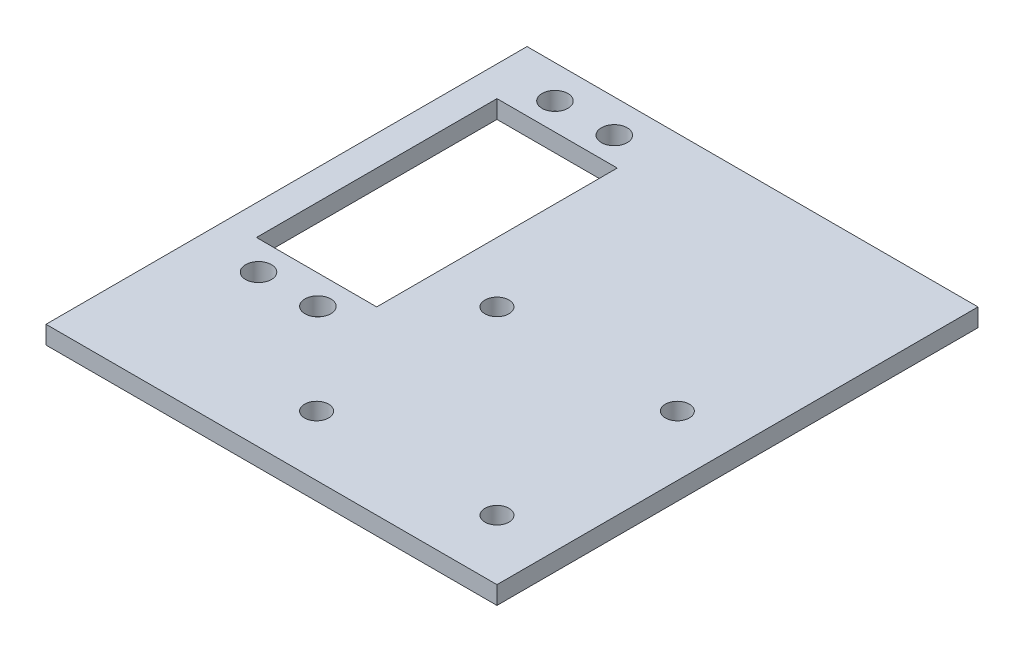
ISO-10303-21;
HEADER;
FILE_DESCRIPTION(('STEP AP214'),'2;1');
FILE_NAME('part.step','',(''),(''),'','','');
FILE_SCHEMA(('AUTOMOTIVE_DESIGN { 1 0 10303 214 1 1 1 1 }'));
ENDSEC;
DATA;
#1=APPLICATION_CONTEXT('core data for automotive mechanical design processes');
#2=APPLICATION_PROTOCOL_DEFINITION('international standard','automotive_design',2000,#1);
#3=PRODUCT_CONTEXT('',#1,'mechanical');
#4=PRODUCT('Part','Part','',(#3));
#5=PRODUCT_RELATED_PRODUCT_CATEGORY('part','',(#4));
#6=PRODUCT_DEFINITION_FORMATION('','',#4);
#7=PRODUCT_DEFINITION_CONTEXT('part definition',#1,'design');
#8=PRODUCT_DEFINITION('design','',#6,#7);
#9=PRODUCT_DEFINITION_SHAPE('','',#8);
#10=(LENGTH_UNIT() NAMED_UNIT(*) SI_UNIT(.MILLI.,.METRE.));
#11=(NAMED_UNIT(*) PLANE_ANGLE_UNIT() SI_UNIT($,.RADIAN.));
#12=(NAMED_UNIT(*) SI_UNIT($,.STERADIAN.) SOLID_ANGLE_UNIT());
#13=UNCERTAINTY_MEASURE_WITH_UNIT(LENGTH_MEASURE(1.E-05),#10,'distance_accuracy_value','');
#14=(GEOMETRIC_REPRESENTATION_CONTEXT(3) GLOBAL_UNCERTAINTY_ASSIGNED_CONTEXT((#13)) GLOBAL_UNIT_ASSIGNED_CONTEXT((#10,
#11,#12)) REPRESENTATION_CONTEXT('',''));
#15=CARTESIAN_POINT('',(0.,0.,0.));
#16=DIRECTION('',(0.,0.,1.));
#17=DIRECTION('',(1.,0.,0.));
#18=AXIS2_PLACEMENT_3D('',#15,#16,#17);
#19=CARTESIAN_POINT('',(-40.,3.,-40.));
#20=DIRECTION('',(0.,0.,1.));
#21=DIRECTION('',(1.,0.,0.));
#22=AXIS2_PLACEMENT_3D('',#19,#20,#21);
#23=PLANE('',#22);
#24=DIRECTION('',(-1.,0.,0.));
#25=VECTOR('',#24,1.);
#26=CARTESIAN_POINT('',(-40.,3.,-40.));
#27=LINE('',#26,#25);
#28=CARTESIAN_POINT('',(35.0000000000232,3.,-40.));
#29=VERTEX_POINT('',#28);
#30=CARTESIAN_POINT('',(-40.,3.,-40.));
#31=VERTEX_POINT('',#30);
#32=EDGE_CURVE('E119',#29,#31,#27,.T.);
#33=ORIENTED_EDGE('',*,*,#32,.F.);
#34=DIRECTION('',(0.,1.,0.));
#35=VECTOR('',#34,1.);
#36=CARTESIAN_POINT('',(35.0000000000232,-7.,-40.));
#37=LINE('',#36,#35);
#38=CARTESIAN_POINT('',(35.0000000000232,0.,-40.));
#39=VERTEX_POINT('',#38);
#40=EDGE_CURVE('E97',#39,#29,#37,.T.);
#41=ORIENTED_EDGE('',*,*,#40,.F.);
#42=DIRECTION('',(-1.,0.,0.));
#43=VECTOR('',#42,1.);
#44=CARTESIAN_POINT('',(-40.,0.,-40.));
#45=LINE('',#44,#43);
#46=CARTESIAN_POINT('',(-40.,0.,-40.));
#47=VERTEX_POINT('',#46);
#48=EDGE_CURVE('E123',#39,#47,#45,.T.);
#49=ORIENTED_EDGE('',*,*,#48,.T.);
#50=DIRECTION('',(0.,-1.,0.));
#51=VECTOR('',#50,1.);
#52=CARTESIAN_POINT('',(-40.,3.,-40.));
#53=LINE('',#52,#51);
#54=EDGE_CURVE('E40',#31,#47,#53,.T.);
#55=ORIENTED_EDGE('',*,*,#54,.F.);
#56=EDGE_LOOP('',(#33,#41,#49,#55));
#57=FACE_BOUND('',#56,.T.);
#58=ADVANCED_FACE('F33',(#57),#23,.F.);
#59=CARTESIAN_POINT('',(-40.,3.,40.));
#60=DIRECTION('',(1.,0.,0.));
#61=DIRECTION('',(0.,0.,-1.));
#62=AXIS2_PLACEMENT_3D('',#59,#60,#61);
#63=PLANE('',#62);
#64=DIRECTION('',(0.,0.,1.));
#65=VECTOR('',#64,1.);
#66=CARTESIAN_POINT('',(-40.,0.,40.));
#67=LINE('',#66,#65);
#68=CARTESIAN_POINT('',(-40.,0.,40.));
#69=VERTEX_POINT('',#68);
#70=EDGE_CURVE('E125',#47,#69,#67,.T.);
#71=ORIENTED_EDGE('',*,*,#70,.T.);
#72=DIRECTION('',(0.,-1.,0.));
#73=VECTOR('',#72,1.);
#74=CARTESIAN_POINT('',(-40.,3.,40.));
#75=LINE('',#74,#73);
#76=CARTESIAN_POINT('',(-40.,3.,40.));
#77=VERTEX_POINT('',#76);
#78=EDGE_CURVE('E116',#77,#69,#75,.T.);
#79=ORIENTED_EDGE('',*,*,#78,.F.);
#80=DIRECTION('',(0.,0.,1.));
#81=VECTOR('',#80,1.);
#82=CARTESIAN_POINT('',(-40.,3.,40.));
#83=LINE('',#82,#81);
#84=EDGE_CURVE('E114',#31,#77,#83,.T.);
#85=ORIENTED_EDGE('',*,*,#84,.F.);
#86=ORIENTED_EDGE('',*,*,#54,.T.);
#87=EDGE_LOOP('',(#71,#79,#85,#86));
#88=FACE_BOUND('',#87,.T.);
#89=ADVANCED_FACE('F132',(#88),#63,.F.);
#90=CARTESIAN_POINT('',(-40.,3.,40.));
#91=DIRECTION('',(0.,0.,-1.));
#92=DIRECTION('',(-1.,0.,0.));
#93=AXIS2_PLACEMENT_3D('',#90,#91,#92);
#94=PLANE('',#93);
#95=DIRECTION('',(1.,0.,0.));
#96=VECTOR('',#95,1.);
#97=CARTESIAN_POINT('',(-40.,0.,40.));
#98=LINE('',#97,#96);
#99=CARTESIAN_POINT('',(35.0000000000232,0.,40.));
#100=VERTEX_POINT('',#99);
#101=EDGE_CURVE('E110',#69,#100,#98,.T.);
#102=ORIENTED_EDGE('',*,*,#101,.T.);
#103=DIRECTION('',(0.,1.,0.));
#104=VECTOR('',#103,1.);
#105=CARTESIAN_POINT('',(35.0000000000232,-7.,40.));
#106=LINE('',#105,#104);
#107=CARTESIAN_POINT('',(35.0000000000232,3.,40.));
#108=VERTEX_POINT('',#107);
#109=EDGE_CURVE('E46',#100,#108,#106,.T.);
#110=ORIENTED_EDGE('',*,*,#109,.T.);
#111=DIRECTION('',(1.,0.,0.));
#112=VECTOR('',#111,1.);
#113=CARTESIAN_POINT('',(-40.,3.,40.));
#114=LINE('',#113,#112);
#115=EDGE_CURVE('E108',#77,#108,#114,.T.);
#116=ORIENTED_EDGE('',*,*,#115,.F.);
#117=ORIENTED_EDGE('',*,*,#78,.T.);
#118=EDGE_LOOP('',(#102,#110,#116,#117));
#119=FACE_BOUND('',#118,.T.);
#120=ADVANCED_FACE('F106',(#119),#94,.F.);
#121=CARTESIAN_POINT('',(0.,3.,0.));
#122=DIRECTION('',(0.,-1.,0.));
#123=DIRECTION('',(0.,0.,-1.));
#124=AXIS2_PLACEMENT_3D('',#121,#122,#123);
#125=PLANE('',#124);
#126=CARTESIAN_POINT('',(25.0000000000232,3.,30.));
#127=DIRECTION('',(0.,-1.,0.));
#128=DIRECTION('',(0.,0.,-1.));
#129=AXIS2_PLACEMENT_3D('',#126,#127,#128);
#130=CIRCLE('',#129,2.);
#131=CARTESIAN_POINT('',(25.0000000000232,3.,28.));
#132=VERTEX_POINT('',#131);
#133=EDGE_CURVE('E101',#132,#132,#130,.T.);
#134=ORIENTED_EDGE('',*,*,#133,.T.);
#135=EDGE_LOOP('',(#134));
#136=FACE_BOUND('',#135,.T.);
#137=CARTESIAN_POINT('',(-4.99999999997651,3.,30.));
#138=DIRECTION('',(0.,-1.,0.));
#139=DIRECTION('',(0.,0.,-1.));
#140=AXIS2_PLACEMENT_3D('',#137,#138,#139);
#141=CIRCLE('',#140,2.);
#142=CARTESIAN_POINT('',(-4.99999999997651,3.,28.));
#143=VERTEX_POINT('',#142);
#144=EDGE_CURVE('E306',#143,#143,#141,.T.);
#145=ORIENTED_EDGE('',*,*,#144,.T.);
#146=EDGE_LOOP('',(#145));
#147=FACE_BOUND('',#146,.T.);
#148=CARTESIAN_POINT('',(-4.99999999997654,3.,1.16226472890446E-13));
#149=DIRECTION('',(0.,-1.,0.));
#150=DIRECTION('',(0.,0.,-1.));
#151=AXIS2_PLACEMENT_3D('',#148,#149,#150);
#152=CIRCLE('',#151,2.);
#153=CARTESIAN_POINT('',(-4.99999999997654,3.,-1.99999999999989));
#154=VERTEX_POINT('',#153);
#155=EDGE_CURVE('E308',#154,#154,#152,.T.);
#156=ORIENTED_EDGE('',*,*,#155,.T.);
#157=EDGE_LOOP('',(#156));
#158=FACE_BOUND('',#157,.T.);
#159=CARTESIAN_POINT('',(25.0000000000232,3.,1.16226472890446E-13));
#160=DIRECTION('',(0.,-1.,0.));
#161=DIRECTION('',(0.,0.,-1.));
#162=AXIS2_PLACEMENT_3D('',#159,#160,#161);
#163=CIRCLE('',#162,2.);
#164=CARTESIAN_POINT('',(25.0000000000232,3.,-1.99999999999989));
#165=VERTEX_POINT('',#164);
#166=EDGE_CURVE('E312',#165,#165,#163,.T.);
#167=ORIENTED_EDGE('',*,*,#166,.T.);
#168=EDGE_LOOP('',(#167));
#169=FACE_BOUND('',#168,.T.);
#170=CARTESIAN_POINT('',(-29.8449999999992,3.,14.8100000000001));
#171=DIRECTION('',(0.,1.,0.));
#172=DIRECTION('',(0.,0.,1.));
#173=AXIS2_PLACEMENT_3D('',#170,#171,#172);
#174=CIRCLE('',#173,2.14999999999946);
#175=CARTESIAN_POINT('',(-29.8449999999992,3.,16.9599999999995));
#176=VERTEX_POINT('',#175);
#177=EDGE_CURVE('E138',#176,#176,#174,.T.);
#178=ORIENTED_EDGE('',*,*,#177,.F.);
#179=EDGE_LOOP('',(#178));
#180=FACE_BOUND('',#179,.T.);
#181=CARTESIAN_POINT('',(-19.9749999999992,3.,14.81));
#182=DIRECTION('',(0.,1.,0.));
#183=DIRECTION('',(0.,0.,1.));
#184=AXIS2_PLACEMENT_3D('',#181,#182,#183);
#185=CIRCLE('',#184,2.1499999999995);
#186=CARTESIAN_POINT('',(-19.9749999999992,3.,16.9599999999995));
#187=VERTEX_POINT('',#186);
#188=EDGE_CURVE('E160',#187,#187,#185,.T.);
#189=ORIENTED_EDGE('',*,*,#188,.F.);
#190=EDGE_LOOP('',(#189));
#191=FACE_BOUND('',#190,.T.);
#192=CARTESIAN_POINT('',(-19.9749999999997,3.,-34.49));
#193=DIRECTION('',(0.,1.,0.));
#194=DIRECTION('',(0.,0.,1.));
#195=AXIS2_PLACEMENT_3D('',#192,#193,#194);
#196=CIRCLE('',#195,2.15);
#197=CARTESIAN_POINT('',(-19.9749999999997,3.,-32.34));
#198=VERTEX_POINT('',#197);
#199=EDGE_CURVE('E154',#198,#198,#196,.T.);
#200=ORIENTED_EDGE('',*,*,#199,.F.);
#201=EDGE_LOOP('',(#200));
#202=FACE_BOUND('',#201,.T.);
#203=CARTESIAN_POINT('',(-29.8449999999997,3.,-34.4899999999999));
#204=DIRECTION('',(0.,1.,0.));
#205=DIRECTION('',(0.,0.,1.));
#206=AXIS2_PLACEMENT_3D('',#203,#204,#205);
#207=CIRCLE('',#206,2.15);
#208=CARTESIAN_POINT('',(-29.8449999999997,3.,-32.3399999999999));
#209=VERTEX_POINT('',#208);
#210=EDGE_CURVE('E148',#209,#209,#207,.T.);
#211=ORIENTED_EDGE('',*,*,#210,.F.);
#212=EDGE_LOOP('',(#211));
#213=FACE_BOUND('',#212,.T.);
#214=DIRECTION('',(1.,0.,0.));
#215=VECTOR('',#214,1.);
#216=CARTESIAN_POINT('',(-35.,3.,10.0000000000001));
#217=LINE('',#216,#215);
#218=CARTESIAN_POINT('',(-35.,3.,10.0000000000001));
#219=VERTEX_POINT('',#218);
#220=CARTESIAN_POINT('',(-15.,3.,10.0000000000001));
#221=VERTEX_POINT('',#220);
#222=EDGE_CURVE('E180',#219,#221,#217,.T.);
#223=ORIENTED_EDGE('',*,*,#222,.F.);
#224=DIRECTION('',(0.,0.,1.));
#225=VECTOR('',#224,1.);
#226=CARTESIAN_POINT('',(-35.,3.,-29.9999999999999));
#227=LINE('',#226,#225);
#228=CARTESIAN_POINT('',(-35.,3.,-29.9999999999999));
#229=VERTEX_POINT('',#228);
#230=EDGE_CURVE('E54',#229,#219,#227,.T.);
#231=ORIENTED_EDGE('',*,*,#230,.F.);
#232=DIRECTION('',(-1.,0.,0.));
#233=VECTOR('',#232,1.);
#234=CARTESIAN_POINT('',(-35.,3.,-29.9999999999999));
#235=LINE('',#234,#233);
#236=CARTESIAN_POINT('',(-15.,3.,-29.9999999999999));
#237=VERTEX_POINT('',#236);
#238=EDGE_CURVE('E169',#237,#229,#235,.T.);
#239=ORIENTED_EDGE('',*,*,#238,.F.);
#240=DIRECTION('',(0.,0.,-1.));
#241=VECTOR('',#240,1.);
#242=CARTESIAN_POINT('',(-15.,3.,-29.9999999999999));
#243=LINE('',#242,#241);
#244=EDGE_CURVE('E183',#221,#237,#243,.T.);
#245=ORIENTED_EDGE('',*,*,#244,.F.);
#246=EDGE_LOOP('',(#223,#231,#239,#245));
#247=FACE_BOUND('',#246,.T.);
#248=ORIENTED_EDGE('',*,*,#115,.T.);
#249=DIRECTION('',(0.,0.,1.));
#250=VECTOR('',#249,1.);
#251=CARTESIAN_POINT('',(35.0000000000232,3.,40.));
#252=LINE('',#251,#250);
#253=EDGE_CURVE('E94',#29,#108,#252,.T.);
#254=ORIENTED_EDGE('',*,*,#253,.F.);
#255=ORIENTED_EDGE('',*,*,#32,.T.);
#256=ORIENTED_EDGE('',*,*,#84,.T.);
#257=EDGE_LOOP('',(#248,#254,#255,#256));
#258=FACE_BOUND('',#257,.T.);
#259=ADVANCED_FACE('F112',(#136,#147,#158,#169,#180,#191,#202,#213,#247,#258),#125,.F.);
#260=CARTESIAN_POINT('',(0.,0.,0.));
#261=DIRECTION('',(0.,-1.,0.));
#262=DIRECTION('',(0.,0.,-1.));
#263=AXIS2_PLACEMENT_3D('',#260,#261,#262);
#264=PLANE('',#263);
#265=CARTESIAN_POINT('',(25.0000000000232,0.,30.));
#266=DIRECTION('',(0.,-1.,0.));
#267=DIRECTION('',(0.,0.,1.));
#268=AXIS2_PLACEMENT_3D('',#265,#266,#267);
#269=CIRCLE('',#268,2.);
#270=CARTESIAN_POINT('',(25.0000000000232,0.,32.));
#271=VERTEX_POINT('',#270);
#272=EDGE_CURVE('E320',#271,#271,#269,.T.);
#273=ORIENTED_EDGE('',*,*,#272,.F.);
#274=EDGE_LOOP('',(#273));
#275=FACE_BOUND('',#274,.T.);
#276=CARTESIAN_POINT('',(-4.99999999997651,0.,30.));
#277=DIRECTION('',(0.,-1.,0.));
#278=DIRECTION('',(0.,0.,-1.));
#279=AXIS2_PLACEMENT_3D('',#276,#277,#278);
#280=CIRCLE('',#279,2.);
#281=CARTESIAN_POINT('',(-4.99999999997651,0.,28.));
#282=VERTEX_POINT('',#281);
#283=EDGE_CURVE('E303',#282,#282,#280,.T.);
#284=ORIENTED_EDGE('',*,*,#283,.F.);
#285=EDGE_LOOP('',(#284));
#286=FACE_BOUND('',#285,.T.);
#287=CARTESIAN_POINT('',(-4.99999999997654,0.,1.16226472890446E-13));
#288=DIRECTION('',(0.,-1.,0.));
#289=DIRECTION('',(0.,0.,1.));
#290=AXIS2_PLACEMENT_3D('',#287,#288,#289);
#291=CIRCLE('',#290,2.);
#292=CARTESIAN_POINT('',(-4.99999999997654,0.,2.00000000000012));
#293=VERTEX_POINT('',#292);
#294=EDGE_CURVE('E319',#293,#293,#291,.T.);
#295=ORIENTED_EDGE('',*,*,#294,.F.);
#296=EDGE_LOOP('',(#295));
#297=FACE_BOUND('',#296,.T.);
#298=CARTESIAN_POINT('',(25.0000000000232,0.,1.16226472890446E-13));
#299=DIRECTION('',(0.,-1.,0.));
#300=DIRECTION('',(0.,0.,-1.));
#301=AXIS2_PLACEMENT_3D('',#298,#299,#300);
#302=CIRCLE('',#301,2.);
#303=CARTESIAN_POINT('',(25.0000000000232,0.,-1.99999999999989));
#304=VERTEX_POINT('',#303);
#305=EDGE_CURVE('E317',#304,#304,#302,.T.);
#306=ORIENTED_EDGE('',*,*,#305,.F.);
#307=EDGE_LOOP('',(#306));
#308=FACE_BOUND('',#307,.T.);
#309=DIRECTION('',(0.,0.,-1.));
#310=VECTOR('',#309,1.);
#311=CARTESIAN_POINT('',(35.0000000000232,0.,0.));
#312=LINE('',#311,#310);
#313=EDGE_CURVE('E11',#100,#39,#312,.T.);
#314=ORIENTED_EDGE('',*,*,#313,.F.);
#315=ORIENTED_EDGE('',*,*,#101,.F.);
#316=ORIENTED_EDGE('',*,*,#70,.F.);
#317=ORIENTED_EDGE('',*,*,#48,.F.);
#318=EDGE_LOOP('',(#314,#315,#316,#317));
#319=FACE_BOUND('',#318,.T.);
#320=CARTESIAN_POINT('',(-29.8449999999992,0.,14.8100000000001));
#321=DIRECTION('',(0.,1.,0.));
#322=DIRECTION('',(0.,0.,1.));
#323=AXIS2_PLACEMENT_3D('',#320,#321,#322);
#324=CIRCLE('',#323,2.14999999999946);
#325=CARTESIAN_POINT('',(-29.8449999999992,0.,16.9599999999995));
#326=VERTEX_POINT('',#325);
#327=EDGE_CURVE('E141',#326,#326,#324,.T.);
#328=ORIENTED_EDGE('',*,*,#327,.T.);
#329=EDGE_LOOP('',(#328));
#330=FACE_BOUND('',#329,.T.);
#331=CARTESIAN_POINT('',(-19.9749999999992,0.,14.81));
#332=DIRECTION('',(0.,1.,0.));
#333=DIRECTION('',(0.,0.,1.));
#334=AXIS2_PLACEMENT_3D('',#331,#332,#333);
#335=CIRCLE('',#334,2.1499999999995);
#336=CARTESIAN_POINT('',(-19.9749999999992,0.,16.9599999999995));
#337=VERTEX_POINT('',#336);
#338=EDGE_CURVE('E157',#337,#337,#335,.T.);
#339=ORIENTED_EDGE('',*,*,#338,.T.);
#340=EDGE_LOOP('',(#339));
#341=FACE_BOUND('',#340,.T.);
#342=CARTESIAN_POINT('',(-19.9749999999997,0.,-34.49));
#343=DIRECTION('',(0.,1.,0.));
#344=DIRECTION('',(0.,0.,1.));
#345=AXIS2_PLACEMENT_3D('',#342,#343,#344);
#346=CIRCLE('',#345,2.15);
#347=CARTESIAN_POINT('',(-19.9749999999997,0.,-32.34));
#348=VERTEX_POINT('',#347);
#349=EDGE_CURVE('E151',#348,#348,#346,.T.);
#350=ORIENTED_EDGE('',*,*,#349,.T.);
#351=EDGE_LOOP('',(#350));
#352=FACE_BOUND('',#351,.T.);
#353=CARTESIAN_POINT('',(-29.8449999999997,0.,-34.4899999999999));
#354=DIRECTION('',(0.,1.,0.));
#355=DIRECTION('',(0.,0.,1.));
#356=AXIS2_PLACEMENT_3D('',#353,#354,#355);
#357=CIRCLE('',#356,2.15);
#358=CARTESIAN_POINT('',(-29.8449999999997,0.,-32.3399999999999));
#359=VERTEX_POINT('',#358);
#360=EDGE_CURVE('E145',#359,#359,#357,.T.);
#361=ORIENTED_EDGE('',*,*,#360,.T.);
#362=EDGE_LOOP('',(#361));
#363=FACE_BOUND('',#362,.T.);
#364=DIRECTION('',(0.,0.,1.));
#365=VECTOR('',#364,1.);
#366=CARTESIAN_POINT('',(-35.,0.,-29.9999999999999));
#367=LINE('',#366,#365);
#368=CARTESIAN_POINT('',(-35.,0.,-29.9999999999999));
#369=VERTEX_POINT('',#368);
#370=CARTESIAN_POINT('',(-35.,0.,10.0000000000001));
#371=VERTEX_POINT('',#370);
#372=EDGE_CURVE('E165',#369,#371,#367,.T.);
#373=ORIENTED_EDGE('',*,*,#372,.T.);
#374=DIRECTION('',(1.,0.,0.));
#375=VECTOR('',#374,1.);
#376=CARTESIAN_POINT('',(-35.,0.,10.0000000000001));
#377=LINE('',#376,#375);
#378=CARTESIAN_POINT('',(-15.,0.,10.0000000000001));
#379=VERTEX_POINT('',#378);
#380=EDGE_CURVE('E168',#371,#379,#377,.T.);
#381=ORIENTED_EDGE('',*,*,#380,.T.);
#382=DIRECTION('',(0.,0.,-1.));
#383=VECTOR('',#382,1.);
#384=CARTESIAN_POINT('',(-15.,0.,-29.9999999999999));
#385=LINE('',#384,#383);
#386=CARTESIAN_POINT('',(-15.,0.,-29.9999999999999));
#387=VERTEX_POINT('',#386);
#388=EDGE_CURVE('E172',#379,#387,#385,.T.);
#389=ORIENTED_EDGE('',*,*,#388,.T.);
#390=DIRECTION('',(-1.,0.,0.));
#391=VECTOR('',#390,1.);
#392=CARTESIAN_POINT('',(-35.,0.,-29.9999999999999));
#393=LINE('',#392,#391);
#394=EDGE_CURVE('E175',#387,#369,#393,.T.);
#395=ORIENTED_EDGE('',*,*,#394,.T.);
#396=EDGE_LOOP('',(#373,#381,#389,#395));
#397=FACE_BOUND('',#396,.T.);
#398=ADVANCED_FACE('F136',(#275,#286,#297,#308,#319,#330,#341,#352,#363,#397),#264,.T.);
#399=CARTESIAN_POINT('',(-35.,0.,-29.9999999999999));
#400=DIRECTION('',(-1.,0.,0.));
#401=DIRECTION('',(0.,0.,1.));
#402=AXIS2_PLACEMENT_3D('',#399,#400,#401);
#403=PLANE('',#402);
#404=ORIENTED_EDGE('',*,*,#230,.T.);
#405=DIRECTION('',(0.,1.,0.));
#406=VECTOR('',#405,1.);
#407=CARTESIAN_POINT('',(-35.,0.,10.0000000000001));
#408=LINE('',#407,#406);
#409=EDGE_CURVE('E178',#371,#219,#408,.T.);
#410=ORIENTED_EDGE('',*,*,#409,.F.);
#411=ORIENTED_EDGE('',*,*,#372,.F.);
#412=DIRECTION('',(0.,1.,0.));
#413=VECTOR('',#412,1.);
#414=CARTESIAN_POINT('',(-35.,0.,-29.9999999999999));
#415=LINE('',#414,#413);
#416=EDGE_CURVE('E126',#369,#229,#415,.T.);
#417=ORIENTED_EDGE('',*,*,#416,.T.);
#418=EDGE_LOOP('',(#404,#410,#411,#417));
#419=FACE_BOUND('',#418,.T.);
#420=ADVANCED_FACE('F206',(#419),#403,.F.);
#421=CARTESIAN_POINT('',(-35.,0.,-29.9999999999999));
#422=DIRECTION('',(0.,0.,-1.));
#423=DIRECTION('',(-1.,0.,0.));
#424=AXIS2_PLACEMENT_3D('',#421,#422,#423);
#425=PLANE('',#424);
#426=ORIENTED_EDGE('',*,*,#238,.T.);
#427=ORIENTED_EDGE('',*,*,#416,.F.);
#428=ORIENTED_EDGE('',*,*,#394,.F.);
#429=DIRECTION('',(0.,1.,0.));
#430=VECTOR('',#429,1.);
#431=CARTESIAN_POINT('',(-15.,0.,-29.9999999999999));
#432=LINE('',#431,#430);
#433=EDGE_CURVE('E189',#387,#237,#432,.T.);
#434=ORIENTED_EDGE('',*,*,#433,.T.);
#435=EDGE_LOOP('',(#426,#427,#428,#434));
#436=FACE_BOUND('',#435,.T.);
#437=ADVANCED_FACE('F208',(#436),#425,.F.);
#438=CARTESIAN_POINT('',(-15.,0.,-29.9999999999999));
#439=DIRECTION('',(1.,0.,0.));
#440=DIRECTION('',(0.,0.,-1.));
#441=AXIS2_PLACEMENT_3D('',#438,#439,#440);
#442=PLANE('',#441);
#443=ORIENTED_EDGE('',*,*,#244,.T.);
#444=ORIENTED_EDGE('',*,*,#433,.F.);
#445=ORIENTED_EDGE('',*,*,#388,.F.);
#446=DIRECTION('',(0.,1.,0.));
#447=VECTOR('',#446,1.);
#448=CARTESIAN_POINT('',(-15.,0.,10.0000000000001));
#449=LINE('',#448,#447);
#450=EDGE_CURVE('E191',#379,#221,#449,.T.);
#451=ORIENTED_EDGE('',*,*,#450,.T.);
#452=EDGE_LOOP('',(#443,#444,#445,#451));
#453=FACE_BOUND('',#452,.T.);
#454=ADVANCED_FACE('F203',(#453),#442,.F.);
#455=CARTESIAN_POINT('',(-35.,0.,10.0000000000001));
#456=DIRECTION('',(0.,0.,1.));
#457=DIRECTION('',(1.,0.,0.));
#458=AXIS2_PLACEMENT_3D('',#455,#456,#457);
#459=PLANE('',#458);
#460=ORIENTED_EDGE('',*,*,#222,.T.);
#461=ORIENTED_EDGE('',*,*,#450,.F.);
#462=ORIENTED_EDGE('',*,*,#380,.F.);
#463=ORIENTED_EDGE('',*,*,#409,.T.);
#464=EDGE_LOOP('',(#460,#461,#462,#463));
#465=FACE_BOUND('',#464,.T.);
#466=ADVANCED_FACE('F196',(#465),#459,.F.);
#467=CARTESIAN_POINT('',(-29.8449999999997,0.,-34.4899999999999));
#468=DIRECTION('',(0.,1.,0.));
#469=DIRECTION('',(0.,0.,1.));
#470=AXIS2_PLACEMENT_3D('',#467,#468,#469);
#471=CYLINDRICAL_SURFACE('',#470,2.15);
#472=ORIENTED_EDGE('',*,*,#360,.F.);
#473=EDGE_LOOP('',(#472));
#474=FACE_BOUND('',#473,.T.);
#475=ORIENTED_EDGE('',*,*,#210,.T.);
#476=EDGE_LOOP('',(#475));
#477=FACE_BOUND('',#476,.T.);
#478=ADVANCED_FACE('F234',(#474,#477),#471,.F.);
#479=CARTESIAN_POINT('',(-19.9749999999997,0.,-34.49));
#480=DIRECTION('',(0.,1.,0.));
#481=DIRECTION('',(0.,0.,1.));
#482=AXIS2_PLACEMENT_3D('',#479,#480,#481);
#483=CYLINDRICAL_SURFACE('',#482,2.15);
#484=ORIENTED_EDGE('',*,*,#349,.F.);
#485=EDGE_LOOP('',(#484));
#486=FACE_BOUND('',#485,.T.);
#487=ORIENTED_EDGE('',*,*,#199,.T.);
#488=EDGE_LOOP('',(#487));
#489=FACE_BOUND('',#488,.T.);
#490=ADVANCED_FACE('F238',(#486,#489),#483,.F.);
#491=CARTESIAN_POINT('',(-19.9749999999992,0.,14.81));
#492=DIRECTION('',(0.,1.,0.));
#493=DIRECTION('',(0.,0.,1.));
#494=AXIS2_PLACEMENT_3D('',#491,#492,#493);
#495=CYLINDRICAL_SURFACE('',#494,2.1499999999995);
#496=ORIENTED_EDGE('',*,*,#338,.F.);
#497=EDGE_LOOP('',(#496));
#498=FACE_BOUND('',#497,.T.);
#499=ORIENTED_EDGE('',*,*,#188,.T.);
#500=EDGE_LOOP('',(#499));
#501=FACE_BOUND('',#500,.T.);
#502=ADVANCED_FACE('F244',(#498,#501),#495,.F.);
#503=CARTESIAN_POINT('',(-29.8449999999992,0.,14.8100000000001));
#504=DIRECTION('',(0.,1.,0.));
#505=DIRECTION('',(0.,0.,1.));
#506=AXIS2_PLACEMENT_3D('',#503,#504,#505);
#507=CYLINDRICAL_SURFACE('',#506,2.14999999999946);
#508=ORIENTED_EDGE('',*,*,#327,.F.);
#509=EDGE_LOOP('',(#508));
#510=FACE_BOUND('',#509,.T.);
#511=ORIENTED_EDGE('',*,*,#177,.T.);
#512=EDGE_LOOP('',(#511));
#513=FACE_BOUND('',#512,.T.);
#514=ADVANCED_FACE('F253',(#510,#513),#507,.F.);
#515=CARTESIAN_POINT('',(35.0000000000232,-7.,40.));
#516=DIRECTION('',(-1.,0.,0.));
#517=DIRECTION('',(0.,0.,1.));
#518=AXIS2_PLACEMENT_3D('',#515,#516,#517);
#519=PLANE('',#518);
#520=ORIENTED_EDGE('',*,*,#313,.T.);
#521=ORIENTED_EDGE('',*,*,#40,.T.);
#522=ORIENTED_EDGE('',*,*,#253,.T.);
#523=ORIENTED_EDGE('',*,*,#109,.F.);
#524=EDGE_LOOP('',(#520,#521,#522,#523));
#525=FACE_BOUND('',#524,.T.);
#526=ADVANCED_FACE('F95',(#525),#519,.F.);
#527=CARTESIAN_POINT('',(25.0000000000232,10.,1.16226472890446E-13));
#528=DIRECTION('',(0.,-1.,0.));
#529=DIRECTION('',(0.,0.,-1.));
#530=AXIS2_PLACEMENT_3D('',#527,#528,#529);
#531=CYLINDRICAL_SURFACE('',#530,2.);
#532=ORIENTED_EDGE('',*,*,#305,.T.);
#533=EDGE_LOOP('',(#532));
#534=FACE_BOUND('',#533,.T.);
#535=ORIENTED_EDGE('',*,*,#166,.F.);
#536=EDGE_LOOP('',(#535));
#537=FACE_BOUND('',#536,.T.);
#538=ADVANCED_FACE('F260',(#534,#537),#531,.F.);
#539=CARTESIAN_POINT('',(-4.99999999997654,10.,1.16226472890446E-13));
#540=DIRECTION('',(0.,-1.,0.));
#541=DIRECTION('',(0.,0.,-1.));
#542=AXIS2_PLACEMENT_3D('',#539,#540,#541);
#543=CYLINDRICAL_SURFACE('',#542,2.);
#544=ORIENTED_EDGE('',*,*,#294,.T.);
#545=EDGE_LOOP('',(#544));
#546=FACE_BOUND('',#545,.T.);
#547=ORIENTED_EDGE('',*,*,#155,.F.);
#548=EDGE_LOOP('',(#547));
#549=FACE_BOUND('',#548,.T.);
#550=ADVANCED_FACE('F281',(#546,#549),#543,.F.);
#551=CARTESIAN_POINT('',(-4.99999999997651,10.,30.));
#552=DIRECTION('',(0.,-1.,0.));
#553=DIRECTION('',(0.,0.,-1.));
#554=AXIS2_PLACEMENT_3D('',#551,#552,#553);
#555=CYLINDRICAL_SURFACE('',#554,2.);
#556=ORIENTED_EDGE('',*,*,#283,.T.);
#557=EDGE_LOOP('',(#556));
#558=FACE_BOUND('',#557,.T.);
#559=ORIENTED_EDGE('',*,*,#144,.F.);
#560=EDGE_LOOP('',(#559));
#561=FACE_BOUND('',#560,.T.);
#562=ADVANCED_FACE('F286',(#558,#561),#555,.F.);
#563=CARTESIAN_POINT('',(25.0000000000232,10.,30.));
#564=DIRECTION('',(0.,-1.,0.));
#565=DIRECTION('',(0.,0.,-1.));
#566=AXIS2_PLACEMENT_3D('',#563,#564,#565);
#567=CYLINDRICAL_SURFACE('',#566,2.);
#568=ORIENTED_EDGE('',*,*,#272,.T.);
#569=EDGE_LOOP('',(#568));
#570=FACE_BOUND('',#569,.T.);
#571=ORIENTED_EDGE('',*,*,#133,.F.);
#572=EDGE_LOOP('',(#571));
#573=FACE_BOUND('',#572,.T.);
#574=ADVANCED_FACE('F292',(#570,#573),#567,.F.);
#575=CLOSED_SHELL('',(#58,#89,#120,#259,#398,#420,#437,#454,#466,#478,#490,#502,#514,#526,#538,
#550,#562,#574));
#576=MANIFOLD_SOLID_BREP('B2',#575);
#577=ADVANCED_BREP_SHAPE_REPRESENTATION('',(#18,#576),#14);
#578=SHAPE_DEFINITION_REPRESENTATION(#9,#577);
ENDSEC;
END-ISO-10303-21;
